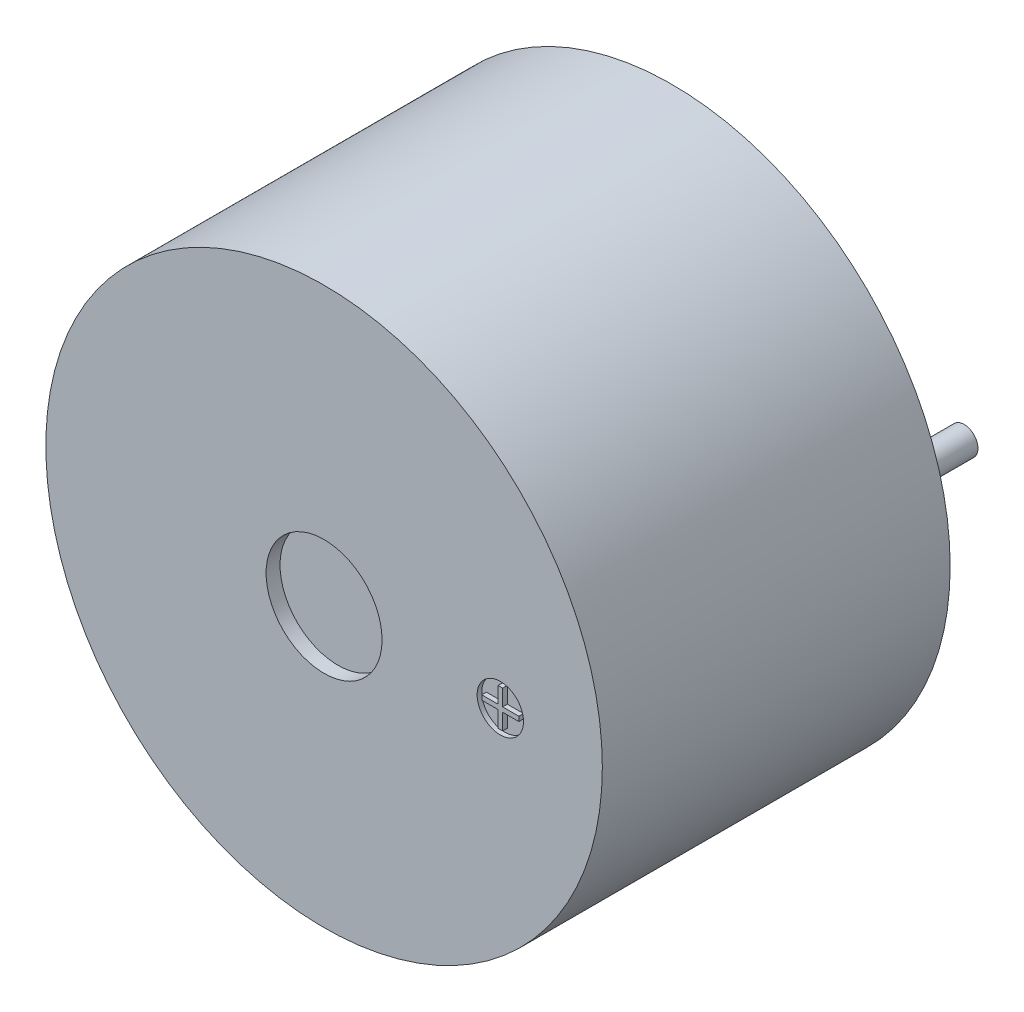
ISO-10303-21;
HEADER;
FILE_DESCRIPTION(('STEP AP214'),'2;1');
FILE_NAME('part.step','',(''),(''),'','','');
FILE_SCHEMA(('AUTOMOTIVE_DESIGN { 1 0 10303 214 1 1 1 1 }'));
ENDSEC;
DATA;
#1=APPLICATION_CONTEXT('core data for automotive mechanical design processes');
#2=APPLICATION_PROTOCOL_DEFINITION('international standard','automotive_design',2000,#1);
#3=PRODUCT_CONTEXT('',#1,'mechanical');
#4=PRODUCT('Part','Part','',(#3));
#5=PRODUCT_RELATED_PRODUCT_CATEGORY('part','',(#4));
#6=PRODUCT_DEFINITION_FORMATION('','',#4);
#7=PRODUCT_DEFINITION_CONTEXT('part definition',#1,'design');
#8=PRODUCT_DEFINITION('design','',#6,#7);
#9=PRODUCT_DEFINITION_SHAPE('','',#8);
#10=(LENGTH_UNIT() NAMED_UNIT(*) SI_UNIT(.MILLI.,.METRE.));
#11=(NAMED_UNIT(*) PLANE_ANGLE_UNIT() SI_UNIT($,.RADIAN.));
#12=(NAMED_UNIT(*) SI_UNIT($,.STERADIAN.) SOLID_ANGLE_UNIT());
#13=UNCERTAINTY_MEASURE_WITH_UNIT(LENGTH_MEASURE(1.E-05),#10,'distance_accuracy_value','');
#14=(GEOMETRIC_REPRESENTATION_CONTEXT(3) GLOBAL_UNCERTAINTY_ASSIGNED_CONTEXT((#13)) GLOBAL_UNIT_ASSIGNED_CONTEXT((#10,
#11,#12)) REPRESENTATION_CONTEXT('',''));
#15=CARTESIAN_POINT('',(0.,0.,0.));
#16=DIRECTION('',(0.,0.,1.));
#17=DIRECTION('',(1.,0.,0.));
#18=AXIS2_PLACEMENT_3D('',#15,#16,#17);
#19=CARTESIAN_POINT('',(0.,0.,7.5));
#20=DIRECTION('',(0.,0.,-1.));
#21=DIRECTION('',(-1.,0.,0.));
#22=AXIS2_PLACEMENT_3D('',#19,#20,#21);
#23=CYLINDRICAL_SURFACE('',#22,6.);
#24=CARTESIAN_POINT('',(0.,0.,7.5));
#25=DIRECTION('',(0.,0.,1.));
#26=DIRECTION('',(1.,0.,0.));
#27=AXIS2_PLACEMENT_3D('',#24,#25,#26);
#28=CIRCLE('',#27,6.);
#29=CARTESIAN_POINT('',(6.,0.,7.5));
#30=VERTEX_POINT('',#29);
#31=EDGE_CURVE('E236',#30,#30,#28,.T.);
#32=ORIENTED_EDGE('',*,*,#31,.F.);
#33=EDGE_LOOP('',(#32));
#34=FACE_BOUND('',#33,.T.);
#35=CARTESIAN_POINT('',(0.,0.,0.));
#36=DIRECTION('',(0.,0.,1.));
#37=DIRECTION('',(1.,0.,0.));
#38=AXIS2_PLACEMENT_3D('',#35,#36,#37);
#39=CIRCLE('',#38,6.);
#40=CARTESIAN_POINT('',(6.,0.,0.));
#41=VERTEX_POINT('',#40);
#42=EDGE_CURVE('E235',#41,#41,#39,.T.);
#43=ORIENTED_EDGE('',*,*,#42,.T.);
#44=EDGE_LOOP('',(#43));
#45=FACE_BOUND('',#44,.T.);
#46=ADVANCED_FACE('F45',(#34,#45),#23,.T.);
#47=CARTESIAN_POINT('',(0.,0.,7.5));
#48=DIRECTION('',(0.,0.,1.));
#49=DIRECTION('',(1.,0.,0.));
#50=AXIS2_PLACEMENT_3D('',#47,#48,#49);
#51=PLANE('',#50);
#52=CARTESIAN_POINT('',(3.8,0.,7.5));
#53=DIRECTION('',(0.,0.,1.));
#54=DIRECTION('',(1.,0.,0.));
#55=AXIS2_PLACEMENT_3D('',#52,#53,#54);
#56=CIRCLE('',#55,0.500000000000001);
#57=CARTESIAN_POINT('',(4.3,0.,7.5));
#58=VERTEX_POINT('',#57);
#59=EDGE_CURVE('E167',#58,#58,#56,.T.);
#60=ORIENTED_EDGE('',*,*,#59,.F.);
#61=EDGE_LOOP('',(#60));
#62=FACE_BOUND('',#61,.T.);
#63=CARTESIAN_POINT('',(0.,0.,7.5));
#64=DIRECTION('',(0.,0.,1.));
#65=DIRECTION('',(1.,0.,0.));
#66=AXIS2_PLACEMENT_3D('',#63,#64,#65);
#67=CIRCLE('',#66,1.25);
#68=CARTESIAN_POINT('',(1.25,0.,7.5));
#69=VERTEX_POINT('',#68);
#70=EDGE_CURVE('E223',#69,#69,#67,.T.);
#71=ORIENTED_EDGE('',*,*,#70,.F.);
#72=EDGE_LOOP('',(#71));
#73=FACE_BOUND('',#72,.T.);
#74=ORIENTED_EDGE('',*,*,#31,.T.);
#75=EDGE_LOOP('',(#74));
#76=FACE_BOUND('',#75,.T.);
#77=ADVANCED_FACE('F252',(#62,#73,#76),#51,.T.);
#78=CARTESIAN_POINT('',(0.,0.,0.));
#79=DIRECTION('',(0.,0.,1.));
#80=DIRECTION('',(1.,0.,0.));
#81=AXIS2_PLACEMENT_3D('',#78,#79,#80);
#82=PLANE('',#81);
#83=CARTESIAN_POINT('',(3.8,0.,0.));
#84=DIRECTION('',(0.,0.,1.));
#85=DIRECTION('',(1.,0.,0.));
#86=AXIS2_PLACEMENT_3D('',#83,#84,#85);
#87=CIRCLE('',#86,0.3);
#88=CARTESIAN_POINT('',(4.1,0.,0.));
#89=VERTEX_POINT('',#88);
#90=EDGE_CURVE('E12',#89,#89,#87,.F.);
#91=ORIENTED_EDGE('',*,*,#90,.F.);
#92=EDGE_LOOP('',(#91));
#93=FACE_BOUND('',#92,.T.);
#94=CARTESIAN_POINT('',(-3.8,0.,0.));
#95=DIRECTION('',(0.,0.,1.));
#96=DIRECTION('',(1.,0.,0.));
#97=AXIS2_PLACEMENT_3D('',#94,#95,#96);
#98=CIRCLE('',#97,0.300000000000001);
#99=CARTESIAN_POINT('',(-3.5,0.,0.));
#100=VERTEX_POINT('',#99);
#101=EDGE_CURVE('E54',#100,#100,#98,.F.);
#102=ORIENTED_EDGE('',*,*,#101,.F.);
#103=EDGE_LOOP('',(#102));
#104=FACE_BOUND('',#103,.T.);
#105=ORIENTED_EDGE('',*,*,#42,.F.);
#106=EDGE_LOOP('',(#105));
#107=FACE_BOUND('',#106,.T.);
#108=ADVANCED_FACE('F249',(#93,#104,#107),#82,.F.);
#109=CARTESIAN_POINT('',(-3.8,0.,-2.5));
#110=DIRECTION('',(0.,0.,1.));
#111=DIRECTION('',(1.,0.,0.));
#112=AXIS2_PLACEMENT_3D('',#109,#110,#111);
#113=CYLINDRICAL_SURFACE('',#112,0.300000000000001);
#114=CARTESIAN_POINT('',(-3.8,0.,-2.5));
#115=DIRECTION('',(0.,0.,-1.));
#116=DIRECTION('',(-1.,0.,0.));
#117=AXIS2_PLACEMENT_3D('',#114,#115,#116);
#118=CIRCLE('',#117,0.300000000000001);
#119=CARTESIAN_POINT('',(-4.1,0.,-2.5));
#120=VERTEX_POINT('',#119);
#121=EDGE_CURVE('E231',#120,#120,#118,.T.);
#122=ORIENTED_EDGE('',*,*,#121,.F.);
#123=EDGE_LOOP('',(#122));
#124=FACE_BOUND('',#123,.T.);
#125=ORIENTED_EDGE('',*,*,#101,.T.);
#126=EDGE_LOOP('',(#125));
#127=FACE_BOUND('',#126,.T.);
#128=ADVANCED_FACE('F247',(#124,#127),#113,.T.);
#129=CARTESIAN_POINT('',(-3.8,0.,-2.5));
#130=DIRECTION('',(0.,0.,-1.));
#131=DIRECTION('',(-1.,0.,0.));
#132=AXIS2_PLACEMENT_3D('',#129,#130,#131);
#133=PLANE('',#132);
#134=ORIENTED_EDGE('',*,*,#121,.T.);
#135=EDGE_LOOP('',(#134));
#136=FACE_BOUND('',#135,.T.);
#137=ADVANCED_FACE('F274',(#136),#133,.T.);
#138=CARTESIAN_POINT('',(3.8,0.,-2.5));
#139=DIRECTION('',(0.,0.,1.));
#140=DIRECTION('',(1.,0.,0.));
#141=AXIS2_PLACEMENT_3D('',#138,#139,#140);
#142=CYLINDRICAL_SURFACE('',#141,0.3);
#143=CARTESIAN_POINT('',(3.8,0.,-2.5));
#144=DIRECTION('',(0.,0.,-1.));
#145=DIRECTION('',(-1.,0.,0.));
#146=AXIS2_PLACEMENT_3D('',#143,#144,#145);
#147=CIRCLE('',#146,0.3);
#148=CARTESIAN_POINT('',(3.5,0.,-2.5));
#149=VERTEX_POINT('',#148);
#150=EDGE_CURVE('E227',#149,#149,#147,.T.);
#151=ORIENTED_EDGE('',*,*,#150,.F.);
#152=EDGE_LOOP('',(#151));
#153=FACE_BOUND('',#152,.T.);
#154=ORIENTED_EDGE('',*,*,#90,.T.);
#155=EDGE_LOOP('',(#154));
#156=FACE_BOUND('',#155,.T.);
#157=ADVANCED_FACE('F278',(#153,#156),#142,.T.);
#158=CARTESIAN_POINT('',(3.8,0.,-2.5));
#159=DIRECTION('',(0.,0.,-1.));
#160=DIRECTION('',(-1.,0.,0.));
#161=AXIS2_PLACEMENT_3D('',#158,#159,#160);
#162=PLANE('',#161);
#163=ORIENTED_EDGE('',*,*,#150,.T.);
#164=EDGE_LOOP('',(#163));
#165=FACE_BOUND('',#164,.T.);
#166=ADVANCED_FACE('F282',(#165),#162,.T.);
#167=CARTESIAN_POINT('',(0.,0.,5.7));
#168=DIRECTION('',(0.,0.,1.));
#169=DIRECTION('',(1.,0.,0.));
#170=AXIS2_PLACEMENT_3D('',#167,#168,#169);
#171=CYLINDRICAL_SURFACE('',#170,1.25);
#172=CARTESIAN_POINT('',(0.,0.,7.2));
#173=DIRECTION('',(0.,0.,1.));
#174=DIRECTION('',(1.,0.,0.));
#175=AXIS2_PLACEMENT_3D('',#172,#173,#174);
#176=CIRCLE('',#175,1.25);
#177=CARTESIAN_POINT('',(1.25,0.,7.2));
#178=VERTEX_POINT('',#177);
#179=EDGE_CURVE('E48',#178,#178,#176,.F.);
#180=ORIENTED_EDGE('',*,*,#179,.T.);
#181=EDGE_LOOP('',(#180));
#182=FACE_BOUND('',#181,.T.);
#183=ORIENTED_EDGE('',*,*,#70,.T.);
#184=EDGE_LOOP('',(#183));
#185=FACE_BOUND('',#184,.T.);
#186=ADVANCED_FACE('F286',(#182,#185),#171,.F.);
#187=CARTESIAN_POINT('',(0.,0.,7.2));
#188=DIRECTION('',(0.,0.,1.));
#189=DIRECTION('',(1.,0.,0.));
#190=AXIS2_PLACEMENT_3D('',#187,#188,#189);
#191=PLANE('',#190);
#192=CARTESIAN_POINT('',(0.,0.,7.2));
#193=DIRECTION('',(0.,0.,1.));
#194=DIRECTION('',(1.,0.,0.));
#195=AXIS2_PLACEMENT_3D('',#192,#193,#194);
#196=CIRCLE('',#195,5.7);
#197=CARTESIAN_POINT('',(5.7,0.,7.2));
#198=VERTEX_POINT('',#197);
#199=EDGE_CURVE('E219',#198,#198,#196,.T.);
#200=ORIENTED_EDGE('',*,*,#199,.F.);
#201=EDGE_LOOP('',(#200));
#202=FACE_BOUND('',#201,.T.);
#203=ORIENTED_EDGE('',*,*,#179,.F.);
#204=EDGE_LOOP('',(#203));
#205=FACE_BOUND('',#204,.T.);
#206=ADVANCED_FACE('F290',(#202,#205),#191,.F.);
#207=CARTESIAN_POINT('',(0.,0.,23.6220346110533));
#208=DIRECTION('',(0.,0.,-1.));
#209=DIRECTION('',(-1.,0.,0.));
#210=AXIS2_PLACEMENT_3D('',#207,#208,#209);
#211=CYLINDRICAL_SURFACE('',#210,5.7);
#212=CARTESIAN_POINT('',(0.,0.,5.7));
#213=DIRECTION('',(0.,0.,1.));
#214=DIRECTION('',(1.,0.,0.));
#215=AXIS2_PLACEMENT_3D('',#212,#213,#214);
#216=CIRCLE('',#215,5.7);
#217=CARTESIAN_POINT('',(5.7,0.,5.7));
#218=VERTEX_POINT('',#217);
#219=EDGE_CURVE('E212',#218,#218,#216,.T.);
#220=ORIENTED_EDGE('',*,*,#219,.F.);
#221=EDGE_LOOP('',(#220));
#222=FACE_BOUND('',#221,.T.);
#223=ORIENTED_EDGE('',*,*,#199,.T.);
#224=EDGE_LOOP('',(#223));
#225=FACE_BOUND('',#224,.T.);
#226=ADVANCED_FACE('F296',(#222,#225),#211,.F.);
#227=CARTESIAN_POINT('',(0.,0.,5.7));
#228=DIRECTION('',(0.,0.,1.));
#229=DIRECTION('',(1.,0.,0.));
#230=AXIS2_PLACEMENT_3D('',#227,#228,#229);
#231=PLANE('',#230);
#232=ORIENTED_EDGE('',*,*,#219,.T.);
#233=EDGE_LOOP('',(#232));
#234=FACE_BOUND('',#233,.T.);
#235=ADVANCED_FACE('F292',(#234),#231,.T.);
#236=CARTESIAN_POINT('',(3.8,0.,7.4));
#237=DIRECTION('',(0.,0.,1.));
#238=DIRECTION('',(1.,0.,0.));
#239=AXIS2_PLACEMENT_3D('',#236,#237,#238);
#240=CYLINDRICAL_SURFACE('',#239,0.500000000000001);
#241=CARTESIAN_POINT('',(3.8,0.,7.4));
#242=DIRECTION('',(0.,0.,1.));
#243=DIRECTION('',(1.,0.,0.));
#244=AXIS2_PLACEMENT_3D('',#241,#242,#243);
#245=CIRCLE('',#244,0.500000000000001);
#246=CARTESIAN_POINT('',(4.3,0.,7.4));
#247=VERTEX_POINT('',#246);
#248=EDGE_CURVE('E208',#247,#247,#245,.T.);
#249=ORIENTED_EDGE('',*,*,#248,.F.);
#250=EDGE_LOOP('',(#249));
#251=FACE_BOUND('',#250,.T.);
#252=ORIENTED_EDGE('',*,*,#59,.T.);
#253=EDGE_LOOP('',(#252));
#254=FACE_BOUND('',#253,.T.);
#255=ADVANCED_FACE('F295',(#251,#254),#240,.F.);
#256=CARTESIAN_POINT('',(3.8,0.,7.4));
#257=DIRECTION('',(0.,0.,1.));
#258=DIRECTION('',(1.,0.,0.));
#259=AXIS2_PLACEMENT_3D('',#256,#257,#258);
#260=PLANE('',#259);
#261=DIRECTION('',(0.,-1.,0.));
#262=VECTOR('',#261,1.);
#263=CARTESIAN_POINT('',(4.2,0.,7.4));
#264=LINE('',#263,#262);
#265=CARTESIAN_POINT('',(4.2,0.0499999999999999,7.4));
#266=VERTEX_POINT('',#265);
#267=CARTESIAN_POINT('',(4.2,-0.0499999999999999,7.4));
#268=VERTEX_POINT('',#267);
#269=EDGE_CURVE('E153',#266,#268,#264,.T.);
#270=ORIENTED_EDGE('',*,*,#269,.T.);
#271=DIRECTION('',(1.,0.,0.));
#272=VECTOR('',#271,1.);
#273=CARTESIAN_POINT('',(0.,-0.0499999999999999,7.4));
#274=LINE('',#273,#272);
#275=CARTESIAN_POINT('',(3.85,-0.0499999999999999,7.4));
#276=VERTEX_POINT('',#275);
#277=EDGE_CURVE('E206',#276,#268,#274,.T.);
#278=ORIENTED_EDGE('',*,*,#277,.F.);
#279=DIRECTION('',(0.,1.,0.));
#280=VECTOR('',#279,1.);
#281=CARTESIAN_POINT('',(3.85,0.,7.4));
#282=LINE('',#281,#280);
#283=CARTESIAN_POINT('',(3.85,-0.4,7.4));
#284=VERTEX_POINT('',#283);
#285=EDGE_CURVE('E61',#284,#276,#282,.T.);
#286=ORIENTED_EDGE('',*,*,#285,.F.);
#287=DIRECTION('',(1.,0.,0.));
#288=VECTOR('',#287,1.);
#289=CARTESIAN_POINT('',(0.,-0.4,7.4));
#290=LINE('',#289,#288);
#291=CARTESIAN_POINT('',(3.75,-0.4,7.4));
#292=VERTEX_POINT('',#291);
#293=EDGE_CURVE('E200',#292,#284,#290,.T.);
#294=ORIENTED_EDGE('',*,*,#293,.F.);
#295=DIRECTION('',(0.,1.,0.));
#296=VECTOR('',#295,1.);
#297=CARTESIAN_POINT('',(3.75,0.,7.4));
#298=LINE('',#297,#296);
#299=CARTESIAN_POINT('',(3.75,-0.0499999999999999,7.4));
#300=VERTEX_POINT('',#299);
#301=EDGE_CURVE('E405',#292,#300,#298,.T.);
#302=ORIENTED_EDGE('',*,*,#301,.T.);
#303=DIRECTION('',(1.,0.,0.));
#304=VECTOR('',#303,1.);
#305=CARTESIAN_POINT('',(0.,-0.0499999999999999,7.4));
#306=LINE('',#305,#304);
#307=CARTESIAN_POINT('',(3.4,-0.0499999999999999,7.4));
#308=VERTEX_POINT('',#307);
#309=EDGE_CURVE('E192',#308,#300,#306,.T.);
#310=ORIENTED_EDGE('',*,*,#309,.F.);
#311=DIRECTION('',(0.,-1.,0.));
#312=VECTOR('',#311,1.);
#313=CARTESIAN_POINT('',(3.4,0.,7.4));
#314=LINE('',#313,#312);
#315=CARTESIAN_POINT('',(3.4,0.0499999999999999,7.4));
#316=VERTEX_POINT('',#315);
#317=EDGE_CURVE('E188',#316,#308,#314,.T.);
#318=ORIENTED_EDGE('',*,*,#317,.F.);
#319=DIRECTION('',(1.,0.,0.));
#320=VECTOR('',#319,1.);
#321=CARTESIAN_POINT('',(0.,0.0499999999999999,7.4));
#322=LINE('',#321,#320);
#323=CARTESIAN_POINT('',(3.75,0.0499999999999999,7.4));
#324=VERTEX_POINT('',#323);
#325=EDGE_CURVE('E401',#316,#324,#322,.T.);
#326=ORIENTED_EDGE('',*,*,#325,.T.);
#327=DIRECTION('',(0.,1.,0.));
#328=VECTOR('',#327,1.);
#329=CARTESIAN_POINT('',(3.75,0.,7.4));
#330=LINE('',#329,#328);
#331=CARTESIAN_POINT('',(3.75,0.4,7.4));
#332=VERTEX_POINT('',#331);
#333=EDGE_CURVE('E392',#324,#332,#330,.T.);
#334=ORIENTED_EDGE('',*,*,#333,.T.);
#335=DIRECTION('',(1.,0.,0.));
#336=VECTOR('',#335,1.);
#337=CARTESIAN_POINT('',(0.,0.4,7.4));
#338=LINE('',#337,#336);
#339=CARTESIAN_POINT('',(3.85,0.4,7.4));
#340=VERTEX_POINT('',#339);
#341=EDGE_CURVE('E388',#332,#340,#338,.T.);
#342=ORIENTED_EDGE('',*,*,#341,.T.);
#343=DIRECTION('',(0.,1.,0.));
#344=VECTOR('',#343,1.);
#345=CARTESIAN_POINT('',(3.85,0.,7.4));
#346=LINE('',#345,#344);
#347=CARTESIAN_POINT('',(3.85,0.0499999999999999,7.4));
#348=VERTEX_POINT('',#347);
#349=EDGE_CURVE('E172',#348,#340,#346,.T.);
#350=ORIENTED_EDGE('',*,*,#349,.F.);
#351=DIRECTION('',(1.,0.,0.));
#352=VECTOR('',#351,1.);
#353=CARTESIAN_POINT('',(0.,0.0499999999999999,7.4));
#354=LINE('',#353,#352);
#355=EDGE_CURVE('E385',#348,#266,#354,.T.);
#356=ORIENTED_EDGE('',*,*,#355,.T.);
#357=EDGE_LOOP('',(#270,#278,#286,#294,#302,#310,#318,#326,#334,#342,#350,#356));
#358=FACE_BOUND('',#357,.T.);
#359=ORIENTED_EDGE('',*,*,#248,.T.);
#360=EDGE_LOOP('',(#359));
#361=FACE_BOUND('',#360,.T.);
#362=ADVANCED_FACE('F306',(#358,#361),#260,.T.);
#363=CARTESIAN_POINT('',(4.2,0.,8.63137084989848));
#364=DIRECTION('',(1.,0.,0.));
#365=DIRECTION('',(0.,0.,-1.));
#366=AXIS2_PLACEMENT_3D('',#363,#364,#365);
#367=PLANE('',#366);
#368=DIRECTION('',(0.,0.,-1.));
#369=VECTOR('',#368,1.);
#370=CARTESIAN_POINT('',(4.2,0.0499999999999999,8.63137084989848));
#371=LINE('',#370,#369);
#372=CARTESIAN_POINT('',(4.2,0.0499999999999999,7.5));
#373=VERTEX_POINT('',#372);
#374=EDGE_CURVE('E140',#373,#266,#371,.T.);
#375=ORIENTED_EDGE('',*,*,#374,.F.);
#376=DIRECTION('',(0.,-1.,0.));
#377=VECTOR('',#376,1.);
#378=CARTESIAN_POINT('',(4.2,0.,7.5));
#379=LINE('',#378,#377);
#380=CARTESIAN_POINT('',(4.2,-0.0499999999999999,7.5));
#381=VERTEX_POINT('',#380);
#382=EDGE_CURVE('E150',#373,#381,#379,.T.);
#383=ORIENTED_EDGE('',*,*,#382,.T.);
#384=DIRECTION('',(0.,0.,-1.));
#385=VECTOR('',#384,1.);
#386=CARTESIAN_POINT('',(4.2,-0.0499999999999999,8.63137084989848));
#387=LINE('',#386,#385);
#388=EDGE_CURVE('E69',#381,#268,#387,.T.);
#389=ORIENTED_EDGE('',*,*,#388,.T.);
#390=ORIENTED_EDGE('',*,*,#269,.F.);
#391=EDGE_LOOP('',(#375,#383,#389,#390));
#392=FACE_BOUND('',#391,.T.);
#393=ADVANCED_FACE('F149',(#392),#367,.T.);
#394=CARTESIAN_POINT('',(0.,0.0499999999999999,8.63137084989848));
#395=DIRECTION('',(0.,1.,0.));
#396=DIRECTION('',(0.,0.,1.));
#397=AXIS2_PLACEMENT_3D('',#394,#395,#396);
#398=PLANE('',#397);
#399=DIRECTION('',(0.,0.,-1.));
#400=VECTOR('',#399,1.);
#401=CARTESIAN_POINT('',(3.85,0.0499999999999999,8.63137084989848));
#402=LINE('',#401,#400);
#403=CARTESIAN_POINT('',(3.85,0.0499999999999999,7.5));
#404=VERTEX_POINT('',#403);
#405=EDGE_CURVE('E142',#404,#348,#402,.T.);
#406=ORIENTED_EDGE('',*,*,#405,.F.);
#407=DIRECTION('',(1.,0.,0.));
#408=VECTOR('',#407,1.);
#409=CARTESIAN_POINT('',(0.,0.0499999999999999,7.5));
#410=LINE('',#409,#408);
#411=EDGE_CURVE('E136',#404,#373,#410,.T.);
#412=ORIENTED_EDGE('',*,*,#411,.T.);
#413=ORIENTED_EDGE('',*,*,#374,.T.);
#414=ORIENTED_EDGE('',*,*,#355,.F.);
#415=EDGE_LOOP('',(#406,#412,#413,#414));
#416=FACE_BOUND('',#415,.T.);
#417=ADVANCED_FACE('F138',(#416),#398,.T.);
#418=CARTESIAN_POINT('',(3.85,0.,8.63137084989848));
#419=DIRECTION('',(-1.,0.,0.));
#420=DIRECTION('',(0.,0.,1.));
#421=AXIS2_PLACEMENT_3D('',#418,#419,#420);
#422=PLANE('',#421);
#423=DIRECTION('',(0.,1.,0.));
#424=VECTOR('',#423,1.);
#425=CARTESIAN_POINT('',(3.85,0.,7.5));
#426=LINE('',#425,#424);
#427=CARTESIAN_POINT('',(3.85,0.4,7.5));
#428=VERTEX_POINT('',#427);
#429=EDGE_CURVE('E378',#404,#428,#426,.T.);
#430=ORIENTED_EDGE('',*,*,#429,.F.);
#431=ORIENTED_EDGE('',*,*,#405,.T.);
#432=ORIENTED_EDGE('',*,*,#349,.T.);
#433=DIRECTION('',(0.,0.,-1.));
#434=VECTOR('',#433,1.);
#435=CARTESIAN_POINT('',(3.85,0.4,8.63137084989848));
#436=LINE('',#435,#434);
#437=EDGE_CURVE('E173',#428,#340,#436,.T.);
#438=ORIENTED_EDGE('',*,*,#437,.F.);
#439=EDGE_LOOP('',(#430,#431,#432,#438));
#440=FACE_BOUND('',#439,.T.);
#441=ADVANCED_FACE('F318',(#440),#422,.F.);
#442=CARTESIAN_POINT('',(0.,0.4,8.63137084989848));
#443=DIRECTION('',(0.,1.,0.));
#444=DIRECTION('',(0.,0.,1.));
#445=AXIS2_PLACEMENT_3D('',#442,#443,#444);
#446=PLANE('',#445);
#447=DIRECTION('',(0.,0.,-1.));
#448=VECTOR('',#447,1.);
#449=CARTESIAN_POINT('',(3.75,0.4,8.63137084989848));
#450=LINE('',#449,#448);
#451=CARTESIAN_POINT('',(3.75,0.4,7.5));
#452=VERTEX_POINT('',#451);
#453=EDGE_CURVE('E178',#452,#332,#450,.T.);
#454=ORIENTED_EDGE('',*,*,#453,.F.);
#455=DIRECTION('',(1.,0.,0.));
#456=VECTOR('',#455,1.);
#457=CARTESIAN_POINT('',(0.,0.4,7.5));
#458=LINE('',#457,#456);
#459=EDGE_CURVE('E177',#452,#428,#458,.T.);
#460=ORIENTED_EDGE('',*,*,#459,.T.);
#461=ORIENTED_EDGE('',*,*,#437,.T.);
#462=ORIENTED_EDGE('',*,*,#341,.F.);
#463=EDGE_LOOP('',(#454,#460,#461,#462));
#464=FACE_BOUND('',#463,.T.);
#465=ADVANCED_FACE('F321',(#464),#446,.T.);
#466=CARTESIAN_POINT('',(3.75,0.,8.63137084989848));
#467=DIRECTION('',(-1.,0.,0.));
#468=DIRECTION('',(0.,0.,1.));
#469=AXIS2_PLACEMENT_3D('',#466,#467,#468);
#470=PLANE('',#469);
#471=DIRECTION('',(0.,0.,-1.));
#472=VECTOR('',#471,1.);
#473=CARTESIAN_POINT('',(3.75,0.0499999999999999,8.63137084989848));
#474=LINE('',#473,#472);
#475=CARTESIAN_POINT('',(3.75,0.0499999999999999,7.5));
#476=VERTEX_POINT('',#475);
#477=EDGE_CURVE('E182',#476,#324,#474,.T.);
#478=ORIENTED_EDGE('',*,*,#477,.F.);
#479=DIRECTION('',(0.,1.,0.));
#480=VECTOR('',#479,1.);
#481=CARTESIAN_POINT('',(3.75,0.,7.5));
#482=LINE('',#481,#480);
#483=EDGE_CURVE('E176',#476,#452,#482,.T.);
#484=ORIENTED_EDGE('',*,*,#483,.T.);
#485=ORIENTED_EDGE('',*,*,#453,.T.);
#486=ORIENTED_EDGE('',*,*,#333,.F.);
#487=EDGE_LOOP('',(#478,#484,#485,#486));
#488=FACE_BOUND('',#487,.T.);
#489=ADVANCED_FACE('F325',(#488),#470,.T.);
#490=CARTESIAN_POINT('',(0.,0.0499999999999999,8.63137084989848));
#491=DIRECTION('',(0.,1.,0.));
#492=DIRECTION('',(0.,0.,1.));
#493=AXIS2_PLACEMENT_3D('',#490,#491,#492);
#494=PLANE('',#493);
#495=DIRECTION('',(0.,0.,-1.));
#496=VECTOR('',#495,1.);
#497=CARTESIAN_POINT('',(3.4,0.0499999999999999,8.63137084989848));
#498=LINE('',#497,#496);
#499=CARTESIAN_POINT('',(3.4,0.0499999999999999,7.5));
#500=VERTEX_POINT('',#499);
#501=EDGE_CURVE('E185',#500,#316,#498,.T.);
#502=ORIENTED_EDGE('',*,*,#501,.F.);
#503=DIRECTION('',(1.,0.,0.));
#504=VECTOR('',#503,1.);
#505=CARTESIAN_POINT('',(0.,0.0499999999999999,7.5));
#506=LINE('',#505,#504);
#507=EDGE_CURVE('E181',#500,#476,#506,.T.);
#508=ORIENTED_EDGE('',*,*,#507,.T.);
#509=ORIENTED_EDGE('',*,*,#477,.T.);
#510=ORIENTED_EDGE('',*,*,#325,.F.);
#511=EDGE_LOOP('',(#502,#508,#509,#510));
#512=FACE_BOUND('',#511,.T.);
#513=ADVANCED_FACE('F329',(#512),#494,.T.);
#514=CARTESIAN_POINT('',(3.4,0.,8.63137084989848));
#515=DIRECTION('',(1.,0.,0.));
#516=DIRECTION('',(0.,0.,-1.));
#517=AXIS2_PLACEMENT_3D('',#514,#515,#516);
#518=PLANE('',#517);
#519=DIRECTION('',(0.,-1.,0.));
#520=VECTOR('',#519,1.);
#521=CARTESIAN_POINT('',(3.4,0.,7.5));
#522=LINE('',#521,#520);
#523=CARTESIAN_POINT('',(3.4,-0.0499999999999999,7.5));
#524=VERTEX_POINT('',#523);
#525=EDGE_CURVE('E374',#500,#524,#522,.T.);
#526=ORIENTED_EDGE('',*,*,#525,.F.);
#527=ORIENTED_EDGE('',*,*,#501,.T.);
#528=ORIENTED_EDGE('',*,*,#317,.T.);
#529=DIRECTION('',(0.,0.,-1.));
#530=VECTOR('',#529,1.);
#531=CARTESIAN_POINT('',(3.4,-0.0499999999999999,8.63137084989848));
#532=LINE('',#531,#530);
#533=EDGE_CURVE('E189',#524,#308,#532,.T.);
#534=ORIENTED_EDGE('',*,*,#533,.F.);
#535=EDGE_LOOP('',(#526,#527,#528,#534));
#536=FACE_BOUND('',#535,.T.);
#537=ADVANCED_FACE('F333',(#536),#518,.F.);
#538=CARTESIAN_POINT('',(0.,-0.0499999999999999,8.63137084989848));
#539=DIRECTION('',(0.,1.,0.));
#540=DIRECTION('',(0.,0.,1.));
#541=AXIS2_PLACEMENT_3D('',#538,#539,#540);
#542=PLANE('',#541);
#543=DIRECTION('',(1.,0.,0.));
#544=VECTOR('',#543,1.);
#545=CARTESIAN_POINT('',(0.,-0.0499999999999999,7.5));
#546=LINE('',#545,#544);
#547=CARTESIAN_POINT('',(3.75,-0.0499999999999999,7.5));
#548=VERTEX_POINT('',#547);
#549=EDGE_CURVE('E364',#524,#548,#546,.T.);
#550=ORIENTED_EDGE('',*,*,#549,.F.);
#551=ORIENTED_EDGE('',*,*,#533,.T.);
#552=ORIENTED_EDGE('',*,*,#309,.T.);
#553=DIRECTION('',(0.,0.,-1.));
#554=VECTOR('',#553,1.);
#555=CARTESIAN_POINT('',(3.75,-0.0499999999999999,8.63137084989848));
#556=LINE('',#555,#554);
#557=EDGE_CURVE('E193',#548,#300,#556,.T.);
#558=ORIENTED_EDGE('',*,*,#557,.F.);
#559=EDGE_LOOP('',(#550,#551,#552,#558));
#560=FACE_BOUND('',#559,.T.);
#561=ADVANCED_FACE('F337',(#560),#542,.F.);
#562=CARTESIAN_POINT('',(3.75,0.,8.63137084989848));
#563=DIRECTION('',(-1.,0.,0.));
#564=DIRECTION('',(0.,0.,1.));
#565=AXIS2_PLACEMENT_3D('',#562,#563,#564);
#566=PLANE('',#565);
#567=DIRECTION('',(0.,0.,-1.));
#568=VECTOR('',#567,1.);
#569=CARTESIAN_POINT('',(3.75,-0.4,8.63137084989848));
#570=LINE('',#569,#568);
#571=CARTESIAN_POINT('',(3.75,-0.4,7.5));
#572=VERTEX_POINT('',#571);
#573=EDGE_CURVE('E196',#572,#292,#570,.T.);
#574=ORIENTED_EDGE('',*,*,#573,.F.);
#575=DIRECTION('',(0.,1.,0.));
#576=VECTOR('',#575,1.);
#577=CARTESIAN_POINT('',(3.75,0.,7.5));
#578=LINE('',#577,#576);
#579=EDGE_CURVE('E197',#572,#548,#578,.T.);
#580=ORIENTED_EDGE('',*,*,#579,.T.);
#581=ORIENTED_EDGE('',*,*,#557,.T.);
#582=ORIENTED_EDGE('',*,*,#301,.F.);
#583=EDGE_LOOP('',(#574,#580,#581,#582));
#584=FACE_BOUND('',#583,.T.);
#585=ADVANCED_FACE('F341',(#584),#566,.T.);
#586=CARTESIAN_POINT('',(0.,-0.4,8.63137084989848));
#587=DIRECTION('',(0.,1.,0.));
#588=DIRECTION('',(0.,0.,1.));
#589=AXIS2_PLACEMENT_3D('',#586,#587,#588);
#590=PLANE('',#589);
#591=DIRECTION('',(1.,0.,0.));
#592=VECTOR('',#591,1.);
#593=CARTESIAN_POINT('',(0.,-0.4,7.5));
#594=LINE('',#593,#592);
#595=CARTESIAN_POINT('',(3.85,-0.4,7.5));
#596=VERTEX_POINT('',#595);
#597=EDGE_CURVE('E359',#572,#596,#594,.T.);
#598=ORIENTED_EDGE('',*,*,#597,.F.);
#599=ORIENTED_EDGE('',*,*,#573,.T.);
#600=ORIENTED_EDGE('',*,*,#293,.T.);
#601=DIRECTION('',(0.,0.,-1.));
#602=VECTOR('',#601,1.);
#603=CARTESIAN_POINT('',(3.85,-0.4,8.63137084989848));
#604=LINE('',#603,#602);
#605=EDGE_CURVE('E201',#596,#284,#604,.T.);
#606=ORIENTED_EDGE('',*,*,#605,.F.);
#607=EDGE_LOOP('',(#598,#599,#600,#606));
#608=FACE_BOUND('',#607,.T.);
#609=ADVANCED_FACE('F345',(#608),#590,.F.);
#610=CARTESIAN_POINT('',(3.85,0.,8.63137084989848));
#611=DIRECTION('',(-1.,0.,0.));
#612=DIRECTION('',(0.,0.,1.));
#613=AXIS2_PLACEMENT_3D('',#610,#611,#612);
#614=PLANE('',#613);
#615=DIRECTION('',(0.,1.,0.));
#616=VECTOR('',#615,1.);
#617=CARTESIAN_POINT('',(3.85,0.,7.5));
#618=LINE('',#617,#616);
#619=CARTESIAN_POINT('',(3.85,-0.0499999999999999,7.5));
#620=VERTEX_POINT('',#619);
#621=EDGE_CURVE('E168',#596,#620,#618,.T.);
#622=ORIENTED_EDGE('',*,*,#621,.F.);
#623=ORIENTED_EDGE('',*,*,#605,.T.);
#624=ORIENTED_EDGE('',*,*,#285,.T.);
#625=DIRECTION('',(0.,0.,-1.));
#626=VECTOR('',#625,1.);
#627=CARTESIAN_POINT('',(3.85,-0.0499999999999999,8.63137084989848));
#628=LINE('',#627,#626);
#629=EDGE_CURVE('E204',#620,#276,#628,.T.);
#630=ORIENTED_EDGE('',*,*,#629,.F.);
#631=EDGE_LOOP('',(#622,#623,#624,#630));
#632=FACE_BOUND('',#631,.T.);
#633=ADVANCED_FACE('F349',(#632),#614,.F.);
#634=CARTESIAN_POINT('',(0.,-0.0499999999999999,8.63137084989848));
#635=DIRECTION('',(0.,1.,0.));
#636=DIRECTION('',(0.,0.,1.));
#637=AXIS2_PLACEMENT_3D('',#634,#635,#636);
#638=PLANE('',#637);
#639=DIRECTION('',(1.,0.,0.));
#640=VECTOR('',#639,1.);
#641=CARTESIAN_POINT('',(0.,-0.0499999999999999,7.5));
#642=LINE('',#641,#640);
#643=EDGE_CURVE('E159',#620,#381,#642,.T.);
#644=ORIENTED_EDGE('',*,*,#643,.F.);
#645=ORIENTED_EDGE('',*,*,#629,.T.);
#646=ORIENTED_EDGE('',*,*,#277,.T.);
#647=ORIENTED_EDGE('',*,*,#388,.F.);
#648=EDGE_LOOP('',(#644,#645,#646,#647));
#649=FACE_BOUND('',#648,.T.);
#650=ADVANCED_FACE('F313',(#649),#638,.F.);
#651=CARTESIAN_POINT('',(0.,0.,7.5));
#652=DIRECTION('',(0.,0.,1.));
#653=DIRECTION('',(1.,0.,0.));
#654=AXIS2_PLACEMENT_3D('',#651,#652,#653);
#655=PLANE('',#654);
#656=ORIENTED_EDGE('',*,*,#382,.F.);
#657=ORIENTED_EDGE('',*,*,#411,.F.);
#658=ORIENTED_EDGE('',*,*,#429,.T.);
#659=ORIENTED_EDGE('',*,*,#459,.F.);
#660=ORIENTED_EDGE('',*,*,#483,.F.);
#661=ORIENTED_EDGE('',*,*,#507,.F.);
#662=ORIENTED_EDGE('',*,*,#525,.T.);
#663=ORIENTED_EDGE('',*,*,#549,.T.);
#664=ORIENTED_EDGE('',*,*,#579,.F.);
#665=ORIENTED_EDGE('',*,*,#597,.T.);
#666=ORIENTED_EDGE('',*,*,#621,.T.);
#667=ORIENTED_EDGE('',*,*,#643,.T.);
#668=EDGE_LOOP('',(#656,#657,#658,#659,#660,#661,#662,#663,#664,#665,#666,#667));
#669=FACE_BOUND('',#668,.T.);
#670=ADVANCED_FACE('F157',(#669),#655,.T.);
#671=CLOSED_SHELL('',(#46,#77,#108,#128,#137,#157,#166,#186,#206,#226,#235,#255,#362,#393,#417,
#441,#465,#489,#513,#537,#561,#585,#609,#633,#650,#670));
#672=MANIFOLD_SOLID_BREP('B2',#671);
#673=ADVANCED_BREP_SHAPE_REPRESENTATION('',(#18,#672),#14);
#674=SHAPE_DEFINITION_REPRESENTATION(#9,#673);
ENDSEC;
END-ISO-10303-21;
